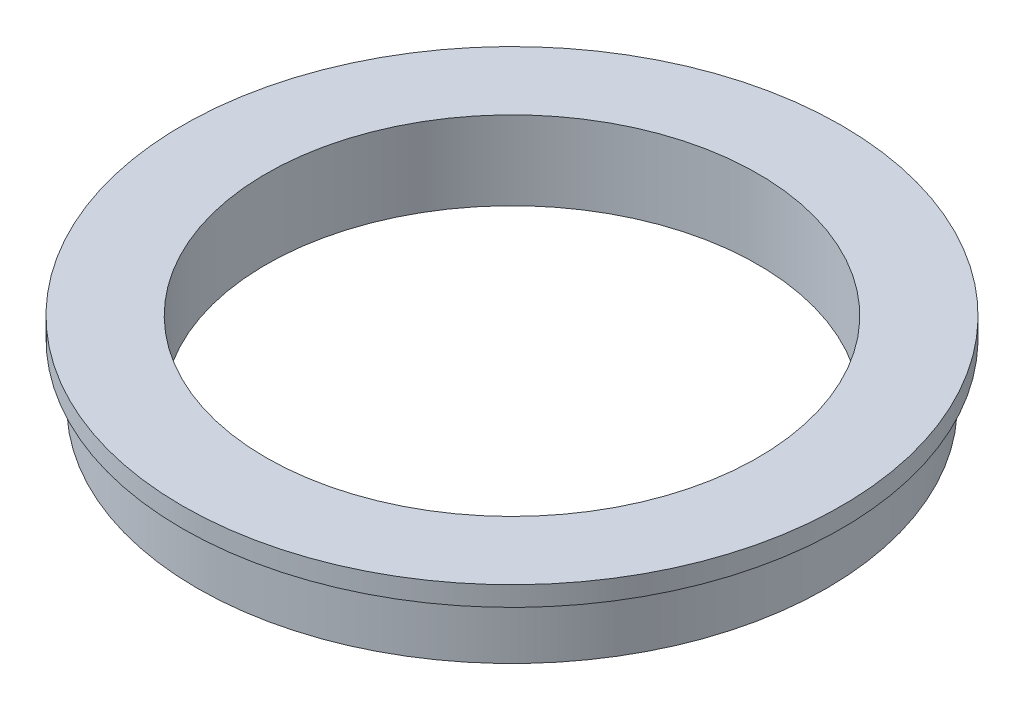
ISO-10303-21;
HEADER;
FILE_DESCRIPTION(('STEP AP214'),'2;1');
FILE_NAME('part.step','',(''),(''),'','','');
FILE_SCHEMA(('AUTOMOTIVE_DESIGN { 1 0 10303 214 1 1 1 1 }'));
ENDSEC;
DATA;
#1=APPLICATION_CONTEXT('core data for automotive mechanical design processes');
#2=APPLICATION_PROTOCOL_DEFINITION('international standard','automotive_design',2000,#1);
#3=PRODUCT_CONTEXT('',#1,'mechanical');
#4=PRODUCT('Part','Part','',(#3));
#5=PRODUCT_RELATED_PRODUCT_CATEGORY('part','',(#4));
#6=PRODUCT_DEFINITION_FORMATION('','',#4);
#7=PRODUCT_DEFINITION_CONTEXT('part definition',#1,'design');
#8=PRODUCT_DEFINITION('design','',#6,#7);
#9=PRODUCT_DEFINITION_SHAPE('','',#8);
#10=(LENGTH_UNIT() NAMED_UNIT(*) SI_UNIT(.MILLI.,.METRE.));
#11=(NAMED_UNIT(*) PLANE_ANGLE_UNIT() SI_UNIT($,.RADIAN.));
#12=(NAMED_UNIT(*) SI_UNIT($,.STERADIAN.) SOLID_ANGLE_UNIT());
#13=UNCERTAINTY_MEASURE_WITH_UNIT(LENGTH_MEASURE(1.E-05),#10,'distance_accuracy_value','');
#14=(GEOMETRIC_REPRESENTATION_CONTEXT(3) GLOBAL_UNCERTAINTY_ASSIGNED_CONTEXT((#13)) GLOBAL_UNIT_ASSIGNED_CONTEXT((#10,
#11,#12)) REPRESENTATION_CONTEXT('',''));
#15=CARTESIAN_POINT('',(0.,0.,0.));
#16=DIRECTION('',(0.,0.,1.));
#17=DIRECTION('',(1.,0.,0.));
#18=AXIS2_PLACEMENT_3D('',#15,#16,#17);
#19=CARTESIAN_POINT('',(0.,4.,0.));
#20=DIRECTION('',(0.,-1.,0.));
#21=DIRECTION('',(0.,0.,-1.));
#22=AXIS2_PLACEMENT_3D('',#19,#20,#21);
#23=CYLINDRICAL_SURFACE('',#22,16.);
#24=CARTESIAN_POINT('',(0.,0.,0.));
#25=DIRECTION('',(0.,1.,0.));
#26=DIRECTION('',(0.,0.,1.));
#27=AXIS2_PLACEMENT_3D('',#24,#25,#26);
#28=CIRCLE('',#27,16.);
#29=CARTESIAN_POINT('',(0.,0.,16.));
#30=VERTEX_POINT('',#29);
#31=EDGE_CURVE('E45',#30,#30,#28,.T.);
#32=ORIENTED_EDGE('',*,*,#31,.T.);
#33=EDGE_LOOP('',(#32));
#34=FACE_BOUND('',#33,.T.);
#35=CARTESIAN_POINT('',(0.,3.,0.));
#36=DIRECTION('',(0.,1.,0.));
#37=DIRECTION('',(0.,0.,1.));
#38=AXIS2_PLACEMENT_3D('',#35,#36,#37);
#39=CIRCLE('',#38,16.);
#40=CARTESIAN_POINT('',(0.,3.,16.));
#41=VERTEX_POINT('',#40);
#42=EDGE_CURVE('E10',#41,#41,#39,.T.);
#43=ORIENTED_EDGE('',*,*,#42,.F.);
#44=EDGE_LOOP('',(#43));
#45=FACE_BOUND('',#44,.T.);
#46=ADVANCED_FACE('F39',(#34,#45),#23,.T.);
#47=CARTESIAN_POINT('',(0.,4.,0.));
#48=DIRECTION('',(0.,1.,0.));
#49=DIRECTION('',(0.,0.,1.));
#50=AXIS2_PLACEMENT_3D('',#47,#48,#49);
#51=PLANE('',#50);
#52=CARTESIAN_POINT('',(0.,4.,0.));
#53=DIRECTION('',(0.,1.,0.));
#54=DIRECTION('',(0.,0.,1.));
#55=AXIS2_PLACEMENT_3D('',#52,#53,#54);
#56=CIRCLE('',#55,12.5);
#57=CARTESIAN_POINT('',(0.,4.,12.5));
#58=VERTEX_POINT('',#57);
#59=EDGE_CURVE('E49',#58,#58,#56,.T.);
#60=ORIENTED_EDGE('',*,*,#59,.F.);
#61=EDGE_LOOP('',(#60));
#62=FACE_BOUND('',#61,.T.);
#63=CARTESIAN_POINT('',(0.,4.,0.));
#64=DIRECTION('',(0.,1.,0.));
#65=DIRECTION('',(0.,0.,1.));
#66=AXIS2_PLACEMENT_3D('',#63,#64,#65);
#67=CIRCLE('',#66,16.75);
#68=CARTESIAN_POINT('',(0.,4.,16.75));
#69=VERTEX_POINT('',#68);
#70=EDGE_CURVE('E59',#69,#69,#67,.T.);
#71=ORIENTED_EDGE('',*,*,#70,.T.);
#72=EDGE_LOOP('',(#71));
#73=FACE_BOUND('',#72,.T.);
#74=ADVANCED_FACE('F77',(#62,#73),#51,.T.);
#75=CARTESIAN_POINT('',(0.,0.,0.));
#76=DIRECTION('',(0.,1.,0.));
#77=DIRECTION('',(0.,0.,1.));
#78=AXIS2_PLACEMENT_3D('',#75,#76,#77);
#79=PLANE('',#78);
#80=ORIENTED_EDGE('',*,*,#31,.F.);
#81=EDGE_LOOP('',(#80));
#82=FACE_BOUND('',#81,.T.);
#83=CARTESIAN_POINT('',(0.,0.,0.));
#84=DIRECTION('',(0.,1.,0.));
#85=DIRECTION('',(0.,0.,1.));
#86=AXIS2_PLACEMENT_3D('',#83,#84,#85);
#87=CIRCLE('',#86,12.5);
#88=CARTESIAN_POINT('',(0.,0.,12.5));
#89=VERTEX_POINT('',#88);
#90=EDGE_CURVE('E53',#89,#89,#87,.T.);
#91=ORIENTED_EDGE('',*,*,#90,.T.);
#92=EDGE_LOOP('',(#91));
#93=FACE_BOUND('',#92,.T.);
#94=ADVANCED_FACE('F82',(#82,#93),#79,.F.);
#95=CARTESIAN_POINT('',(0.,4.,0.));
#96=DIRECTION('',(0.,-1.,0.));
#97=DIRECTION('',(0.,0.,-1.));
#98=AXIS2_PLACEMENT_3D('',#95,#96,#97);
#99=CYLINDRICAL_SURFACE('',#98,12.5);
#100=ORIENTED_EDGE('',*,*,#59,.T.);
#101=EDGE_LOOP('',(#100));
#102=FACE_BOUND('',#101,.T.);
#103=ORIENTED_EDGE('',*,*,#90,.F.);
#104=EDGE_LOOP('',(#103));
#105=FACE_BOUND('',#104,.T.);
#106=ADVANCED_FACE('F74',(#102,#105),#99,.F.);
#107=CARTESIAN_POINT('',(0.,3.,0.));
#108=DIRECTION('',(0.,1.,0.));
#109=DIRECTION('',(0.,0.,1.));
#110=AXIS2_PLACEMENT_3D('',#107,#108,#109);
#111=CYLINDRICAL_SURFACE('',#110,16.75);
#112=CARTESIAN_POINT('',(0.,3.,0.));
#113=DIRECTION('',(0.,1.,0.));
#114=DIRECTION('',(0.,0.,1.));
#115=AXIS2_PLACEMENT_3D('',#112,#113,#114);
#116=CIRCLE('',#115,16.75);
#117=CARTESIAN_POINT('',(0.,3.,16.75));
#118=VERTEX_POINT('',#117);
#119=EDGE_CURVE('E57',#118,#118,#116,.T.);
#120=ORIENTED_EDGE('',*,*,#119,.T.);
#121=EDGE_LOOP('',(#120));
#122=FACE_BOUND('',#121,.T.);
#123=ORIENTED_EDGE('',*,*,#70,.F.);
#124=EDGE_LOOP('',(#123));
#125=FACE_BOUND('',#124,.T.);
#126=ADVANCED_FACE('F65',(#122,#125),#111,.T.);
#127=CARTESIAN_POINT('',(0.,3.,0.));
#128=DIRECTION('',(0.,1.,0.));
#129=DIRECTION('',(0.,0.,1.));
#130=AXIS2_PLACEMENT_3D('',#127,#128,#129);
#131=PLANE('',#130);
#132=ORIENTED_EDGE('',*,*,#42,.T.);
#133=EDGE_LOOP('',(#132));
#134=FACE_BOUND('',#133,.T.);
#135=ORIENTED_EDGE('',*,*,#119,.F.);
#136=EDGE_LOOP('',(#135));
#137=FACE_BOUND('',#136,.T.);
#138=ADVANCED_FACE('F68',(#134,#137),#131,.F.);
#139=CLOSED_SHELL('',(#46,#74,#94,#106,#126,#138));
#140=MANIFOLD_SOLID_BREP('B2',#139);
#141=ADVANCED_BREP_SHAPE_REPRESENTATION('',(#18,#140),#14);
#142=SHAPE_DEFINITION_REPRESENTATION(#9,#141);
ENDSEC;
END-ISO-10303-21;
